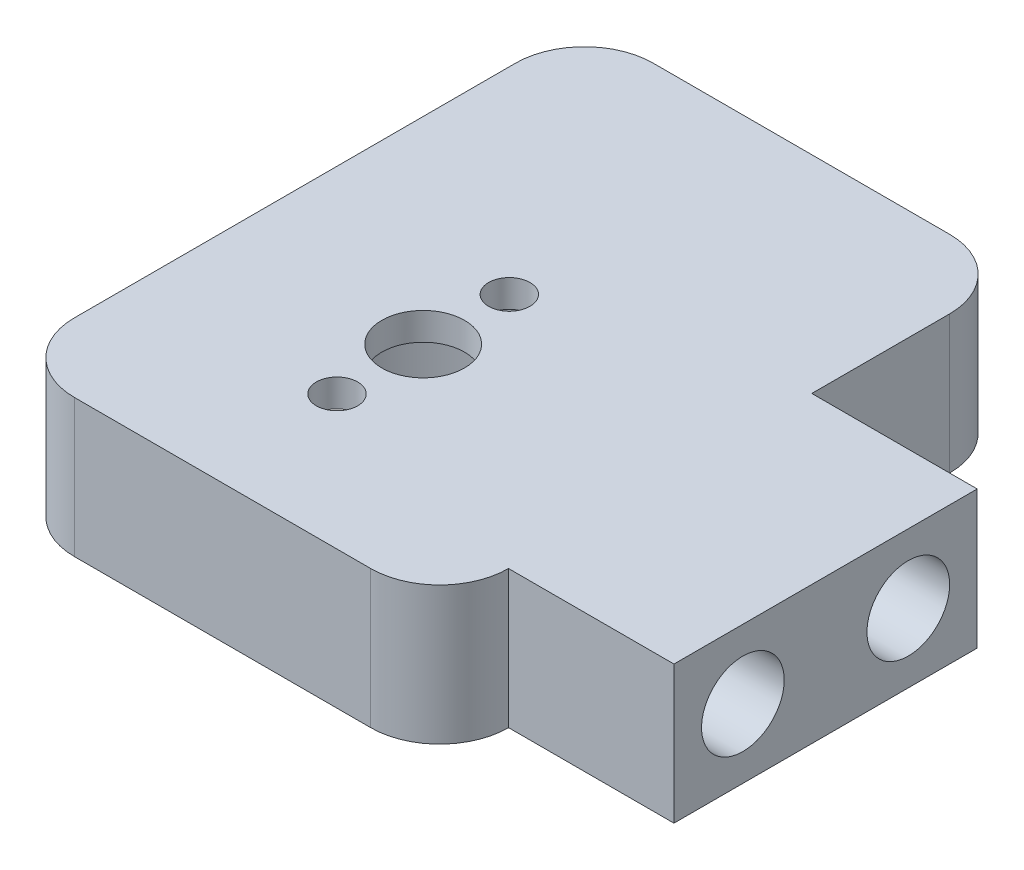
ISO-10303-21;
HEADER;
FILE_DESCRIPTION(('STEP AP214'),'2;1');
FILE_NAME('part.step','',(''),(''),'','','');
FILE_SCHEMA(('AUTOMOTIVE_DESIGN { 1 0 10303 214 1 1 1 1 }'));
ENDSEC;
DATA;
#1=APPLICATION_CONTEXT('core data for automotive mechanical design processes');
#2=APPLICATION_PROTOCOL_DEFINITION('international standard','automotive_design',2000,#1);
#3=PRODUCT_CONTEXT('',#1,'mechanical');
#4=PRODUCT('Part','Part','',(#3));
#5=PRODUCT_RELATED_PRODUCT_CATEGORY('part','',(#4));
#6=PRODUCT_DEFINITION_FORMATION('','',#4);
#7=PRODUCT_DEFINITION_CONTEXT('part definition',#1,'design');
#8=PRODUCT_DEFINITION('design','',#6,#7);
#9=PRODUCT_DEFINITION_SHAPE('','',#8);
#10=(LENGTH_UNIT() NAMED_UNIT(*) SI_UNIT(.MILLI.,.METRE.));
#11=(NAMED_UNIT(*) PLANE_ANGLE_UNIT() SI_UNIT($,.RADIAN.));
#12=(NAMED_UNIT(*) SI_UNIT($,.STERADIAN.) SOLID_ANGLE_UNIT());
#13=UNCERTAINTY_MEASURE_WITH_UNIT(LENGTH_MEASURE(1.E-05),#10,'distance_accuracy_value','');
#14=(GEOMETRIC_REPRESENTATION_CONTEXT(3) GLOBAL_UNCERTAINTY_ASSIGNED_CONTEXT((#13)) GLOBAL_UNIT_ASSIGNED_CONTEXT((#10,
#11,#12)) REPRESENTATION_CONTEXT('',''));
#15=CARTESIAN_POINT('',(0.,0.,0.));
#16=DIRECTION('',(0.,0.,1.));
#17=DIRECTION('',(1.,0.,0.));
#18=AXIS2_PLACEMENT_3D('',#15,#16,#17);
#19=CARTESIAN_POINT('',(0.,0.,0.));
#20=DIRECTION('',(0.,1.,0.));
#21=DIRECTION('',(0.,0.,1.));
#22=AXIS2_PLACEMENT_3D('',#19,#20,#21);
#23=PLANE('',#22);
#24=CARTESIAN_POINT('',(-11.6954640360802,0.,0.));
#25=DIRECTION('',(0.,-1.,0.));
#26=DIRECTION('',(0.,0.,-1.));
#27=AXIS2_PLACEMENT_3D('',#24,#25,#26);
#28=CIRCLE('',#27,11.);
#29=CARTESIAN_POINT('',(-11.6954640360802,0.,-11.));
#30=VERTEX_POINT('',#29);
#31=EDGE_CURVE('E225',#30,#30,#28,.T.);
#32=ORIENTED_EDGE('',*,*,#31,.F.);
#33=EDGE_LOOP('',(#32));
#34=FACE_BOUND('',#33,.T.);
#35=DIRECTION('',(0.,0.,1.));
#36=VECTOR('',#35,1.);
#37=CARTESIAN_POINT('',(0.500000000000008,0.,-24.));
#38=LINE('',#37,#36);
#39=CARTESIAN_POINT('',(0.500000000000008,0.,-26.));
#40=VERTEX_POINT('',#39);
#41=CARTESIAN_POINT('',(0.500000000000008,0.,-24.));
#42=VERTEX_POINT('',#41);
#43=EDGE_CURVE('E184',#40,#42,#38,.T.);
#44=ORIENTED_EDGE('',*,*,#43,.F.);
#45=CARTESIAN_POINT('',(0.500000000000008,0.,-21.));
#46=DIRECTION('',(0.,1.,0.));
#47=DIRECTION('',(0.,0.,1.));
#48=AXIS2_PLACEMENT_3D('',#45,#46,#47);
#49=CIRCLE('',#48,5.);
#50=CARTESIAN_POINT('',(5.50000000000001,0.,-21.));
#51=VERTEX_POINT('',#50);
#52=EDGE_CURVE('E326',#40,#51,#49,.F.);
#53=ORIENTED_EDGE('',*,*,#52,.T.);
#54=DIRECTION('',(0.,0.,-1.));
#55=VECTOR('',#54,1.);
#56=CARTESIAN_POINT('',(5.50000000000001,0.,-11.));
#57=LINE('',#56,#55);
#58=CARTESIAN_POINT('',(5.50000000000001,0.,-11.));
#59=VERTEX_POINT('',#58);
#60=EDGE_CURVE('E279',#59,#51,#57,.T.);
#61=ORIENTED_EDGE('',*,*,#60,.F.);
#62=DIRECTION('',(-1.,0.,0.));
#63=VECTOR('',#62,1.);
#64=CARTESIAN_POINT('',(5.50000000000001,0.,-11.));
#65=LINE('',#64,#63);
#66=CARTESIAN_POINT('',(17.5,0.,-11.));
#67=VERTEX_POINT('',#66);
#68=EDGE_CURVE('E276',#67,#59,#65,.T.);
#69=ORIENTED_EDGE('',*,*,#68,.F.);
#70=DIRECTION('',(0.,0.,-1.));
#71=VECTOR('',#70,1.);
#72=CARTESIAN_POINT('',(17.5,0.,-11.));
#73=LINE('',#72,#71);
#74=CARTESIAN_POINT('',(17.5,0.,11.));
#75=VERTEX_POINT('',#74);
#76=EDGE_CURVE('E233',#75,#67,#73,.T.);
#77=ORIENTED_EDGE('',*,*,#76,.F.);
#78=DIRECTION('',(1.,0.,0.));
#79=VECTOR('',#78,1.);
#80=CARTESIAN_POINT('',(5.50000000000001,0.,11.));
#81=LINE('',#80,#79);
#82=CARTESIAN_POINT('',(5.50000000000001,0.,11.));
#83=VERTEX_POINT('',#82);
#84=EDGE_CURVE('E250',#83,#75,#81,.T.);
#85=ORIENTED_EDGE('',*,*,#84,.F.);
#86=CARTESIAN_POINT('',(0.500000000000013,0.,11.));
#87=DIRECTION('',(0.,1.,0.));
#88=DIRECTION('',(0.,0.,1.));
#89=AXIS2_PLACEMENT_3D('',#86,#87,#88);
#90=CIRCLE('',#89,5.);
#91=CARTESIAN_POINT('',(0.500000000000014,0.,16.));
#92=VERTEX_POINT('',#91);
#93=EDGE_CURVE('E323',#83,#92,#90,.F.);
#94=ORIENTED_EDGE('',*,*,#93,.T.);
#95=DIRECTION('',(1.,0.,0.));
#96=VECTOR('',#95,1.);
#97=CARTESIAN_POINT('',(-26.,0.,16.));
#98=LINE('',#97,#96);
#99=CARTESIAN_POINT('',(-21.,0.,16.));
#100=VERTEX_POINT('',#99);
#101=EDGE_CURVE('E287',#100,#92,#98,.T.);
#102=ORIENTED_EDGE('',*,*,#101,.F.);
#103=CARTESIAN_POINT('',(-21.,0.,11.));
#104=DIRECTION('',(0.,1.,0.));
#105=DIRECTION('',(0.,0.,1.));
#106=AXIS2_PLACEMENT_3D('',#103,#104,#105);
#107=CIRCLE('',#106,5.);
#108=CARTESIAN_POINT('',(-26.,0.,11.));
#109=VERTEX_POINT('',#108);
#110=EDGE_CURVE('E320',#100,#109,#107,.F.);
#111=ORIENTED_EDGE('',*,*,#110,.T.);
#112=DIRECTION('',(0.,0.,1.));
#113=VECTOR('',#112,1.);
#114=CARTESIAN_POINT('',(-26.,0.,-26.));
#115=LINE('',#114,#113);
#116=CARTESIAN_POINT('',(-26.,0.,-21.));
#117=VERTEX_POINT('',#116);
#118=EDGE_CURVE('E283',#117,#109,#115,.T.);
#119=ORIENTED_EDGE('',*,*,#118,.F.);
#120=CARTESIAN_POINT('',(-21.,0.,-21.));
#121=DIRECTION('',(0.,1.,0.));
#122=DIRECTION('',(0.,0.,1.));
#123=AXIS2_PLACEMENT_3D('',#120,#121,#122);
#124=CIRCLE('',#123,5.);
#125=CARTESIAN_POINT('',(-21.,0.,-26.));
#126=VERTEX_POINT('',#125);
#127=EDGE_CURVE('E177',#117,#126,#124,.F.);
#128=ORIENTED_EDGE('',*,*,#127,.T.);
#129=DIRECTION('',(0.,0.,-1.));
#130=VECTOR('',#129,1.);
#131=CARTESIAN_POINT('',(-21.,0.,-26.));
#132=LINE('',#131,#130);
#133=CARTESIAN_POINT('',(-21.,0.,-24.));
#134=VERTEX_POINT('',#133);
#135=EDGE_CURVE('E160',#134,#126,#132,.T.);
#136=ORIENTED_EDGE('',*,*,#135,.F.);
#137=DIRECTION('',(-1.,0.,0.));
#138=VECTOR('',#137,1.);
#139=CARTESIAN_POINT('',(0.500000000000008,0.,-24.));
#140=LINE('',#139,#138);
#141=EDGE_CURVE('E174',#42,#134,#140,.T.);
#142=ORIENTED_EDGE('',*,*,#141,.F.);
#143=EDGE_LOOP('',(#44,#53,#61,#69,#77,#85,#94,#102,#111,#119,#128,#136,#142));
#144=FACE_BOUND('',#143,.T.);
#145=ADVANCED_FACE('F43',(#34,#144),#23,.F.);
#146=CARTESIAN_POINT('',(17.5,10.,-11.));
#147=DIRECTION('',(-1.,0.,0.));
#148=DIRECTION('',(0.,0.,1.));
#149=AXIS2_PLACEMENT_3D('',#146,#147,#148);
#150=PLANE('',#149);
#151=CARTESIAN_POINT('',(17.5,5.,6.));
#152=DIRECTION('',(1.,0.,0.));
#153=DIRECTION('',(0.,0.,-1.));
#154=AXIS2_PLACEMENT_3D('',#151,#152,#153);
#155=CIRCLE('',#154,3.);
#156=CARTESIAN_POINT('',(17.5,5.,3.));
#157=VERTEX_POINT('',#156);
#158=EDGE_CURVE('E234',#157,#157,#155,.T.);
#159=ORIENTED_EDGE('',*,*,#158,.F.);
#160=EDGE_LOOP('',(#159));
#161=FACE_BOUND('',#160,.T.);
#162=CARTESIAN_POINT('',(17.5,5.,-6.));
#163=DIRECTION('',(1.,0.,0.));
#164=DIRECTION('',(0.,0.,-1.));
#165=AXIS2_PLACEMENT_3D('',#162,#163,#164);
#166=CIRCLE('',#165,3.);
#167=CARTESIAN_POINT('',(17.5,5.,-9.));
#168=VERTEX_POINT('',#167);
#169=EDGE_CURVE('E224',#168,#168,#166,.T.);
#170=ORIENTED_EDGE('',*,*,#169,.F.);
#171=EDGE_LOOP('',(#170));
#172=FACE_BOUND('',#171,.T.);
#173=ORIENTED_EDGE('',*,*,#76,.T.);
#174=DIRECTION('',(0.,-1.,0.));
#175=VECTOR('',#174,1.);
#176=CARTESIAN_POINT('',(17.5,10.,-11.));
#177=LINE('',#176,#175);
#178=CARTESIAN_POINT('',(17.5,10.,-11.));
#179=VERTEX_POINT('',#178);
#180=EDGE_CURVE('E304',#179,#67,#177,.T.);
#181=ORIENTED_EDGE('',*,*,#180,.F.);
#182=DIRECTION('',(0.,0.,-1.));
#183=VECTOR('',#182,1.);
#184=CARTESIAN_POINT('',(17.5,10.,-11.));
#185=LINE('',#184,#183);
#186=CARTESIAN_POINT('',(17.5,10.,11.));
#187=VERTEX_POINT('',#186);
#188=EDGE_CURVE('E245',#187,#179,#185,.T.);
#189=ORIENTED_EDGE('',*,*,#188,.F.);
#190=DIRECTION('',(0.,-1.,0.));
#191=VECTOR('',#190,1.);
#192=CARTESIAN_POINT('',(17.5,10.,11.));
#193=LINE('',#192,#191);
#194=EDGE_CURVE('E272',#187,#75,#193,.T.);
#195=ORIENTED_EDGE('',*,*,#194,.T.);
#196=EDGE_LOOP('',(#173,#181,#189,#195));
#197=FACE_BOUND('',#196,.T.);
#198=ADVANCED_FACE('F432',(#161,#172,#197),#150,.F.);
#199=CARTESIAN_POINT('',(5.50000000000001,10.,-11.));
#200=DIRECTION('',(0.,0.,1.));
#201=DIRECTION('',(1.,0.,0.));
#202=AXIS2_PLACEMENT_3D('',#199,#200,#201);
#203=PLANE('',#202);
#204=ORIENTED_EDGE('',*,*,#68,.T.);
#205=DIRECTION('',(0.,-1.,0.));
#206=VECTOR('',#205,1.);
#207=CARTESIAN_POINT('',(5.50000000000001,10.,-11.));
#208=LINE('',#207,#206);
#209=CARTESIAN_POINT('',(5.50000000000001,10.,-11.));
#210=VERTEX_POINT('',#209);
#211=EDGE_CURVE('E300',#210,#59,#208,.T.);
#212=ORIENTED_EDGE('',*,*,#211,.F.);
#213=DIRECTION('',(-1.,0.,0.));
#214=VECTOR('',#213,1.);
#215=CARTESIAN_POINT('',(5.50000000000001,10.,-11.));
#216=LINE('',#215,#214);
#217=EDGE_CURVE('E249',#179,#210,#216,.T.);
#218=ORIENTED_EDGE('',*,*,#217,.F.);
#219=ORIENTED_EDGE('',*,*,#180,.T.);
#220=EDGE_LOOP('',(#204,#212,#218,#219));
#221=FACE_BOUND('',#220,.T.);
#222=ADVANCED_FACE('F434',(#221),#203,.F.);
#223=CARTESIAN_POINT('',(5.50000000000001,10.,-11.));
#224=DIRECTION('',(-1.,0.,0.));
#225=DIRECTION('',(0.,0.,1.));
#226=AXIS2_PLACEMENT_3D('',#223,#224,#225);
#227=PLANE('',#226);
#228=ORIENTED_EDGE('',*,*,#60,.T.);
#229=DIRECTION('',(0.,-1.,0.));
#230=VECTOR('',#229,1.);
#231=CARTESIAN_POINT('',(5.50000000000001,10.,-21.));
#232=LINE('',#231,#230);
#233=CARTESIAN_POINT('',(5.50000000000001,10.,-21.));
#234=VERTEX_POINT('',#233);
#235=EDGE_CURVE('E329',#51,#234,#232,.F.);
#236=ORIENTED_EDGE('',*,*,#235,.T.);
#237=DIRECTION('',(0.,0.,-1.));
#238=VECTOR('',#237,1.);
#239=CARTESIAN_POINT('',(5.50000000000001,10.,-11.));
#240=LINE('',#239,#238);
#241=EDGE_CURVE('E253',#210,#234,#240,.T.);
#242=ORIENTED_EDGE('',*,*,#241,.F.);
#243=ORIENTED_EDGE('',*,*,#211,.T.);
#244=EDGE_LOOP('',(#228,#236,#242,#243));
#245=FACE_BOUND('',#244,.T.);
#246=ADVANCED_FACE('F394',(#245),#227,.F.);
#247=CARTESIAN_POINT('',(5.50000000000001,10.,-26.));
#248=DIRECTION('',(0.,0.,1.));
#249=DIRECTION('',(1.,0.,0.));
#250=AXIS2_PLACEMENT_3D('',#247,#248,#249);
#251=PLANE('',#250);
#252=CARTESIAN_POINT('',(-16.,-5.,-26.));
#253=DIRECTION('',(0.,0.,1.));
#254=DIRECTION('',(1.,0.,0.));
#255=AXIS2_PLACEMENT_3D('',#252,#253,#254);
#256=CIRCLE('',#255,3.);
#257=CARTESIAN_POINT('',(-13.,-5.,-26.));
#258=VERTEX_POINT('',#257);
#259=EDGE_CURVE('E187',#258,#258,#256,.T.);
#260=ORIENTED_EDGE('',*,*,#259,.T.);
#261=EDGE_LOOP('',(#260));
#262=FACE_BOUND('',#261,.T.);
#263=CARTESIAN_POINT('',(-4.49999999999999,-5.,-26.));
#264=DIRECTION('',(0.,0.,1.));
#265=DIRECTION('',(1.,0.,0.));
#266=AXIS2_PLACEMENT_3D('',#263,#264,#265);
#267=CIRCLE('',#266,3.);
#268=CARTESIAN_POINT('',(-1.49999999999999,-5.,-26.));
#269=VERTEX_POINT('',#268);
#270=EDGE_CURVE('E468',#269,#269,#267,.T.);
#271=ORIENTED_EDGE('',*,*,#270,.T.);
#272=EDGE_LOOP('',(#271));
#273=FACE_BOUND('',#272,.T.);
#274=DIRECTION('',(0.,1.,0.));
#275=VECTOR('',#274,1.);
#276=CARTESIAN_POINT('',(0.500000000000008,-12.,-26.));
#277=LINE('',#276,#275);
#278=CARTESIAN_POINT('',(0.500000000000008,-7.,-26.));
#279=VERTEX_POINT('',#278);
#280=EDGE_CURVE('E191',#279,#40,#277,.T.);
#281=ORIENTED_EDGE('',*,*,#280,.F.);
#282=CARTESIAN_POINT('',(-4.49999999999999,-7.,-26.));
#283=DIRECTION('',(0.,0.,1.));
#284=DIRECTION('',(1.,0.,0.));
#285=AXIS2_PLACEMENT_3D('',#282,#283,#284);
#286=CIRCLE('',#285,5.);
#287=CARTESIAN_POINT('',(-4.49999999999999,-12.,-26.));
#288=VERTEX_POINT('',#287);
#289=EDGE_CURVE('E52',#279,#288,#286,.F.);
#290=ORIENTED_EDGE('',*,*,#289,.T.);
#291=DIRECTION('',(1.,0.,0.));
#292=VECTOR('',#291,1.);
#293=CARTESIAN_POINT('',(0.500000000000008,-12.,-26.));
#294=LINE('',#293,#292);
#295=CARTESIAN_POINT('',(-16.,-12.,-26.));
#296=VERTEX_POINT('',#295);
#297=EDGE_CURVE('E194',#296,#288,#294,.T.);
#298=ORIENTED_EDGE('',*,*,#297,.F.);
#299=CARTESIAN_POINT('',(-16.,-7.,-26.));
#300=DIRECTION('',(0.,0.,1.));
#301=DIRECTION('',(1.,0.,0.));
#302=AXIS2_PLACEMENT_3D('',#299,#300,#301);
#303=CIRCLE('',#302,5.);
#304=CARTESIAN_POINT('',(-21.,-7.,-26.));
#305=VERTEX_POINT('',#304);
#306=EDGE_CURVE('E59',#296,#305,#303,.F.);
#307=ORIENTED_EDGE('',*,*,#306,.T.);
#308=DIRECTION('',(0.,1.,0.));
#309=VECTOR('',#308,1.);
#310=CARTESIAN_POINT('',(-21.,-12.,-26.));
#311=LINE('',#310,#309);
#312=EDGE_CURVE('E168',#305,#126,#311,.T.);
#313=ORIENTED_EDGE('',*,*,#312,.T.);
#314=DIRECTION('',(0.,-1.,0.));
#315=VECTOR('',#314,1.);
#316=CARTESIAN_POINT('',(-21.,10.,-26.));
#317=LINE('',#316,#315);
#318=CARTESIAN_POINT('',(-21.,10.,-26.));
#319=VERTEX_POINT('',#318);
#320=EDGE_CURVE('E308',#126,#319,#317,.F.);
#321=ORIENTED_EDGE('',*,*,#320,.T.);
#322=DIRECTION('',(-1.,0.,0.));
#323=VECTOR('',#322,1.);
#324=CARTESIAN_POINT('',(5.50000000000001,10.,-26.));
#325=LINE('',#324,#323);
#326=CARTESIAN_POINT('',(0.500000000000007,10.,-26.));
#327=VERTEX_POINT('',#326);
#328=EDGE_CURVE('E257',#327,#319,#325,.T.);
#329=ORIENTED_EDGE('',*,*,#328,.F.);
#330=DIRECTION('',(0.,-1.,0.));
#331=VECTOR('',#330,1.);
#332=CARTESIAN_POINT('',(0.500000000000007,10.,-26.));
#333=LINE('',#332,#331);
#334=EDGE_CURVE('E314',#327,#40,#333,.T.);
#335=ORIENTED_EDGE('',*,*,#334,.T.);
#336=EDGE_LOOP('',(#281,#290,#298,#307,#313,#321,#329,#335));
#337=FACE_BOUND('',#336,.T.);
#338=ADVANCED_FACE('F378',(#262,#273,#337),#251,.F.);
#339=CARTESIAN_POINT('',(-26.,10.,-26.));
#340=DIRECTION('',(1.,0.,0.));
#341=DIRECTION('',(0.,0.,-1.));
#342=AXIS2_PLACEMENT_3D('',#339,#340,#341);
#343=PLANE('',#342);
#344=ORIENTED_EDGE('',*,*,#118,.T.);
#345=DIRECTION('',(0.,-1.,0.));
#346=VECTOR('',#345,1.);
#347=CARTESIAN_POINT('',(-26.,10.,11.));
#348=LINE('',#347,#346);
#349=CARTESIAN_POINT('',(-26.,10.,11.));
#350=VERTEX_POINT('',#349);
#351=EDGE_CURVE('E355',#109,#350,#348,.F.);
#352=ORIENTED_EDGE('',*,*,#351,.T.);
#353=DIRECTION('',(0.,0.,1.));
#354=VECTOR('',#353,1.);
#355=CARTESIAN_POINT('',(-26.,10.,-26.));
#356=LINE('',#355,#354);
#357=CARTESIAN_POINT('',(-26.,10.,-21.));
#358=VERTEX_POINT('',#357);
#359=EDGE_CURVE('E261',#358,#350,#356,.T.);
#360=ORIENTED_EDGE('',*,*,#359,.F.);
#361=DIRECTION('',(0.,-1.,0.));
#362=VECTOR('',#361,1.);
#363=CARTESIAN_POINT('',(-26.,10.,-21.));
#364=LINE('',#363,#362);
#365=EDGE_CURVE('E351',#358,#117,#364,.T.);
#366=ORIENTED_EDGE('',*,*,#365,.T.);
#367=EDGE_LOOP('',(#344,#352,#360,#366));
#368=FACE_BOUND('',#367,.T.);
#369=ADVANCED_FACE('F409',(#368),#343,.F.);
#370=CARTESIAN_POINT('',(-26.,10.,16.));
#371=DIRECTION('',(0.,0.,-1.));
#372=DIRECTION('',(-1.,0.,0.));
#373=AXIS2_PLACEMENT_3D('',#370,#371,#372);
#374=PLANE('',#373);
#375=ORIENTED_EDGE('',*,*,#101,.T.);
#376=DIRECTION('',(0.,-1.,0.));
#377=VECTOR('',#376,1.);
#378=CARTESIAN_POINT('',(0.500000000000014,10.,16.));
#379=LINE('',#378,#377);
#380=CARTESIAN_POINT('',(0.500000000000014,10.,16.));
#381=VERTEX_POINT('',#380);
#382=EDGE_CURVE('E348',#92,#381,#379,.F.);
#383=ORIENTED_EDGE('',*,*,#382,.T.);
#384=DIRECTION('',(1.,0.,0.));
#385=VECTOR('',#384,1.);
#386=CARTESIAN_POINT('',(-26.,10.,16.));
#387=LINE('',#386,#385);
#388=CARTESIAN_POINT('',(-21.,10.,16.));
#389=VERTEX_POINT('',#388);
#390=EDGE_CURVE('E265',#389,#381,#387,.T.);
#391=ORIENTED_EDGE('',*,*,#390,.F.);
#392=DIRECTION('',(0.,-1.,0.));
#393=VECTOR('',#392,1.);
#394=CARTESIAN_POINT('',(-21.,10.,16.));
#395=LINE('',#394,#393);
#396=EDGE_CURVE('E344',#389,#100,#395,.T.);
#397=ORIENTED_EDGE('',*,*,#396,.T.);
#398=EDGE_LOOP('',(#375,#383,#391,#397));
#399=FACE_BOUND('',#398,.T.);
#400=ADVANCED_FACE('F417',(#399),#374,.F.);
#401=CARTESIAN_POINT('',(5.50000000000001,10.,11.));
#402=DIRECTION('',(0.,0.,-1.));
#403=DIRECTION('',(-1.,0.,0.));
#404=AXIS2_PLACEMENT_3D('',#401,#402,#403);
#405=PLANE('',#404);
#406=ORIENTED_EDGE('',*,*,#84,.T.);
#407=ORIENTED_EDGE('',*,*,#194,.F.);
#408=DIRECTION('',(1.,0.,0.));
#409=VECTOR('',#408,1.);
#410=CARTESIAN_POINT('',(5.50000000000001,10.,11.));
#411=LINE('',#410,#409);
#412=CARTESIAN_POINT('',(5.50000000000001,10.,11.));
#413=VERTEX_POINT('',#412);
#414=EDGE_CURVE('E269',#413,#187,#411,.T.);
#415=ORIENTED_EDGE('',*,*,#414,.F.);
#416=DIRECTION('',(0.,-1.,0.));
#417=VECTOR('',#416,1.);
#418=CARTESIAN_POINT('',(5.50000000000001,10.,11.));
#419=LINE('',#418,#417);
#420=EDGE_CURVE('E296',#413,#83,#419,.T.);
#421=ORIENTED_EDGE('',*,*,#420,.T.);
#422=EDGE_LOOP('',(#406,#407,#415,#421));
#423=FACE_BOUND('',#422,.T.);
#424=ADVANCED_FACE('F426',(#423),#405,.F.);
#425=CARTESIAN_POINT('',(0.,10.,0.));
#426=DIRECTION('',(0.,1.,0.));
#427=DIRECTION('',(0.,0.,1.));
#428=AXIS2_PLACEMENT_3D('',#425,#426,#427);
#429=PLANE('',#428);
#430=CARTESIAN_POINT('',(-11.6954640360802,10.,-6.25));
#431=DIRECTION('',(0.,1.,0.));
#432=DIRECTION('',(0.,0.,1.));
#433=AXIS2_PLACEMENT_3D('',#430,#431,#432);
#434=CIRCLE('',#433,1.5);
#435=CARTESIAN_POINT('',(-11.6954640360802,10.,-4.75));
#436=VERTEX_POINT('',#435);
#437=EDGE_CURVE('E215',#436,#436,#434,.T.);
#438=ORIENTED_EDGE('',*,*,#437,.F.);
#439=EDGE_LOOP('',(#438));
#440=FACE_BOUND('',#439,.T.);
#441=CARTESIAN_POINT('',(-11.6954640360802,10.,6.25));
#442=DIRECTION('',(0.,1.,0.));
#443=DIRECTION('',(0.,0.,1.));
#444=AXIS2_PLACEMENT_3D('',#441,#442,#443);
#445=CIRCLE('',#444,1.5);
#446=CARTESIAN_POINT('',(-11.6954640360802,10.,7.75));
#447=VERTEX_POINT('',#446);
#448=EDGE_CURVE('E211',#447,#447,#445,.T.);
#449=ORIENTED_EDGE('',*,*,#448,.F.);
#450=EDGE_LOOP('',(#449));
#451=FACE_BOUND('',#450,.T.);
#452=CARTESIAN_POINT('',(-11.6954640360802,10.,0.));
#453=DIRECTION('',(0.,1.,0.));
#454=DIRECTION('',(0.,0.,1.));
#455=AXIS2_PLACEMENT_3D('',#452,#453,#454);
#456=CIRCLE('',#455,3.);
#457=CARTESIAN_POINT('',(-11.6954640360802,10.,3.));
#458=VERTEX_POINT('',#457);
#459=EDGE_CURVE('E219',#458,#458,#456,.T.);
#460=ORIENTED_EDGE('',*,*,#459,.F.);
#461=EDGE_LOOP('',(#460));
#462=FACE_BOUND('',#461,.T.);
#463=ORIENTED_EDGE('',*,*,#241,.T.);
#464=CARTESIAN_POINT('',(0.500000000000008,10.,-21.));
#465=DIRECTION('',(0.,1.,0.));
#466=DIRECTION('',(0.,0.,1.));
#467=AXIS2_PLACEMENT_3D('',#464,#465,#466);
#468=CIRCLE('',#467,5.);
#469=EDGE_CURVE('E341',#234,#327,#468,.T.);
#470=ORIENTED_EDGE('',*,*,#469,.T.);
#471=ORIENTED_EDGE('',*,*,#328,.T.);
#472=CARTESIAN_POINT('',(-21.,10.,-21.));
#473=DIRECTION('',(0.,1.,0.));
#474=DIRECTION('',(0.,0.,1.));
#475=AXIS2_PLACEMENT_3D('',#472,#473,#474);
#476=CIRCLE('',#475,5.);
#477=EDGE_CURVE('E332',#319,#358,#476,.T.);
#478=ORIENTED_EDGE('',*,*,#477,.T.);
#479=ORIENTED_EDGE('',*,*,#359,.T.);
#480=CARTESIAN_POINT('',(-21.,10.,11.));
#481=DIRECTION('',(0.,1.,0.));
#482=DIRECTION('',(0.,0.,1.));
#483=AXIS2_PLACEMENT_3D('',#480,#481,#482);
#484=CIRCLE('',#483,5.);
#485=EDGE_CURVE('E335',#350,#389,#484,.T.);
#486=ORIENTED_EDGE('',*,*,#485,.T.);
#487=ORIENTED_EDGE('',*,*,#390,.T.);
#488=CARTESIAN_POINT('',(0.500000000000013,10.,11.));
#489=DIRECTION('',(0.,1.,0.));
#490=DIRECTION('',(0.,0.,1.));
#491=AXIS2_PLACEMENT_3D('',#488,#489,#490);
#492=CIRCLE('',#491,5.);
#493=EDGE_CURVE('E338',#381,#413,#492,.T.);
#494=ORIENTED_EDGE('',*,*,#493,.T.);
#495=ORIENTED_EDGE('',*,*,#414,.T.);
#496=ORIENTED_EDGE('',*,*,#188,.T.);
#497=ORIENTED_EDGE('',*,*,#217,.T.);
#498=EDGE_LOOP('',(#463,#470,#471,#478,#479,#486,#487,#494,#495,#496,#497));
#499=FACE_BOUND('',#498,.T.);
#500=ADVANCED_FACE('F401',(#440,#451,#462,#499),#429,.T.);
#501=CARTESIAN_POINT('',(7.50000000000001,5.,-6.));
#502=DIRECTION('',(1.,0.,0.));
#503=DIRECTION('',(0.,0.,-1.));
#504=AXIS2_PLACEMENT_3D('',#501,#502,#503);
#505=CYLINDRICAL_SURFACE('',#504,3.);
#506=CARTESIAN_POINT('',(7.50000000000001,5.,-6.));
#507=DIRECTION('',(1.,0.,0.));
#508=DIRECTION('',(0.,0.,-1.));
#509=AXIS2_PLACEMENT_3D('',#506,#507,#508);
#510=CIRCLE('',#509,3.);
#511=CARTESIAN_POINT('',(7.50000000000001,5.,-9.));
#512=VERTEX_POINT('',#511);
#513=EDGE_CURVE('E238',#512,#512,#510,.T.);
#514=ORIENTED_EDGE('',*,*,#513,.F.);
#515=EDGE_LOOP('',(#514));
#516=FACE_BOUND('',#515,.T.);
#517=ORIENTED_EDGE('',*,*,#169,.T.);
#518=EDGE_LOOP('',(#517));
#519=FACE_BOUND('',#518,.T.);
#520=ADVANCED_FACE('F547',(#516,#519),#505,.F.);
#521=CARTESIAN_POINT('',(7.50000000000001,5.,-6.));
#522=DIRECTION('',(1.,0.,0.));
#523=DIRECTION('',(0.,0.,-1.));
#524=AXIS2_PLACEMENT_3D('',#521,#522,#523);
#525=PLANE('',#524);
#526=ORIENTED_EDGE('',*,*,#513,.T.);
#527=EDGE_LOOP('',(#526));
#528=FACE_BOUND('',#527,.T.);
#529=ADVANCED_FACE('F544',(#528),#525,.T.);
#530=CARTESIAN_POINT('',(7.50000000000001,5.,6.));
#531=DIRECTION('',(1.,0.,0.));
#532=DIRECTION('',(0.,0.,-1.));
#533=AXIS2_PLACEMENT_3D('',#530,#531,#532);
#534=CYLINDRICAL_SURFACE('',#533,3.);
#535=CARTESIAN_POINT('',(7.50000000000001,5.,6.));
#536=DIRECTION('',(1.,0.,0.));
#537=DIRECTION('',(0.,0.,-1.));
#538=AXIS2_PLACEMENT_3D('',#535,#536,#537);
#539=CIRCLE('',#538,3.);
#540=CARTESIAN_POINT('',(7.50000000000001,5.,3.));
#541=VERTEX_POINT('',#540);
#542=EDGE_CURVE('E229',#541,#541,#539,.T.);
#543=ORIENTED_EDGE('',*,*,#542,.F.);
#544=EDGE_LOOP('',(#543));
#545=FACE_BOUND('',#544,.T.);
#546=ORIENTED_EDGE('',*,*,#158,.T.);
#547=EDGE_LOOP('',(#546));
#548=FACE_BOUND('',#547,.T.);
#549=ADVANCED_FACE('F540',(#545,#548),#534,.F.);
#550=CARTESIAN_POINT('',(7.50000000000001,5.,6.));
#551=DIRECTION('',(1.,0.,0.));
#552=DIRECTION('',(0.,0.,-1.));
#553=AXIS2_PLACEMENT_3D('',#550,#551,#552);
#554=PLANE('',#553);
#555=ORIENTED_EDGE('',*,*,#542,.T.);
#556=EDGE_LOOP('',(#555));
#557=FACE_BOUND('',#556,.T.);
#558=ADVANCED_FACE('F536',(#557),#554,.T.);
#559=CARTESIAN_POINT('',(-11.6954640360802,8.,0.));
#560=DIRECTION('',(0.,-1.,0.));
#561=DIRECTION('',(0.,0.,-1.));
#562=AXIS2_PLACEMENT_3D('',#559,#560,#561);
#563=CYLINDRICAL_SURFACE('',#562,11.);
#564=CARTESIAN_POINT('',(-11.6954640360802,8.,0.));
#565=DIRECTION('',(0.,-1.,0.));
#566=DIRECTION('',(0.,0.,-1.));
#567=AXIS2_PLACEMENT_3D('',#564,#565,#566);
#568=CIRCLE('',#567,11.);
#569=CARTESIAN_POINT('',(-11.6954640360802,8.,-11.));
#570=VERTEX_POINT('',#569);
#571=EDGE_CURVE('E220',#570,#570,#568,.T.);
#572=ORIENTED_EDGE('',*,*,#571,.F.);
#573=EDGE_LOOP('',(#572));
#574=FACE_BOUND('',#573,.T.);
#575=ORIENTED_EDGE('',*,*,#31,.T.);
#576=EDGE_LOOP('',(#575));
#577=FACE_BOUND('',#576,.T.);
#578=ADVANCED_FACE('F532',(#574,#577),#563,.F.);
#579=CARTESIAN_POINT('',(-11.6954640360802,8.,0.));
#580=DIRECTION('',(0.,-1.,0.));
#581=DIRECTION('',(0.,0.,-1.));
#582=AXIS2_PLACEMENT_3D('',#579,#580,#581);
#583=PLANE('',#582);
#584=CARTESIAN_POINT('',(-11.6954640360802,8.,0.));
#585=DIRECTION('',(0.,-1.,0.));
#586=DIRECTION('',(0.,0.,-1.));
#587=AXIS2_PLACEMENT_3D('',#584,#585,#586);
#588=CIRCLE('',#587,3.);
#589=CARTESIAN_POINT('',(-11.6954640360802,8.,-3.));
#590=VERTEX_POINT('',#589);
#591=EDGE_CURVE('E204',#590,#590,#588,.T.);
#592=ORIENTED_EDGE('',*,*,#591,.F.);
#593=EDGE_LOOP('',(#592));
#594=FACE_BOUND('',#593,.T.);
#595=CARTESIAN_POINT('',(-11.6954640360802,8.,-6.25));
#596=DIRECTION('',(0.,-1.,0.));
#597=DIRECTION('',(0.,0.,-1.));
#598=AXIS2_PLACEMENT_3D('',#595,#596,#597);
#599=CIRCLE('',#598,1.5);
#600=CARTESIAN_POINT('',(-11.6954640360802,8.,-7.75));
#601=VERTEX_POINT('',#600);
#602=EDGE_CURVE('E199',#601,#601,#599,.T.);
#603=ORIENTED_EDGE('',*,*,#602,.F.);
#604=EDGE_LOOP('',(#603));
#605=FACE_BOUND('',#604,.T.);
#606=CARTESIAN_POINT('',(-11.6954640360802,8.,6.25));
#607=DIRECTION('',(0.,-1.,0.));
#608=DIRECTION('',(0.,0.,-1.));
#609=AXIS2_PLACEMENT_3D('',#606,#607,#608);
#610=CIRCLE('',#609,1.5);
#611=CARTESIAN_POINT('',(-11.6954640360802,8.,4.75));
#612=VERTEX_POINT('',#611);
#613=EDGE_CURVE('E200',#612,#612,#610,.T.);
#614=ORIENTED_EDGE('',*,*,#613,.F.);
#615=EDGE_LOOP('',(#614));
#616=FACE_BOUND('',#615,.T.);
#617=ORIENTED_EDGE('',*,*,#571,.T.);
#618=EDGE_LOOP('',(#617));
#619=FACE_BOUND('',#618,.T.);
#620=ADVANCED_FACE('F522',(#594,#605,#616,#619),#583,.T.);
#621=CARTESIAN_POINT('',(-11.6954640360802,16.,6.25));
#622=DIRECTION('',(0.,-1.,0.));
#623=DIRECTION('',(0.,0.,-1.));
#624=AXIS2_PLACEMENT_3D('',#621,#622,#623);
#625=CYLINDRICAL_SURFACE('',#624,1.5);
#626=ORIENTED_EDGE('',*,*,#448,.T.);
#627=EDGE_LOOP('',(#626));
#628=FACE_BOUND('',#627,.T.);
#629=ORIENTED_EDGE('',*,*,#613,.T.);
#630=EDGE_LOOP('',(#629));
#631=FACE_BOUND('',#630,.T.);
#632=ADVANCED_FACE('F518',(#628,#631),#625,.F.);
#633=CARTESIAN_POINT('',(-11.6954640360802,16.,-6.25));
#634=DIRECTION('',(0.,-1.,0.));
#635=DIRECTION('',(0.,0.,-1.));
#636=AXIS2_PLACEMENT_3D('',#633,#634,#635);
#637=CYLINDRICAL_SURFACE('',#636,1.5);
#638=ORIENTED_EDGE('',*,*,#437,.T.);
#639=EDGE_LOOP('',(#638));
#640=FACE_BOUND('',#639,.T.);
#641=ORIENTED_EDGE('',*,*,#602,.T.);
#642=EDGE_LOOP('',(#641));
#643=FACE_BOUND('',#642,.T.);
#644=ADVANCED_FACE('F521',(#640,#643),#637,.F.);
#645=CARTESIAN_POINT('',(-11.6954640360802,16.,0.));
#646=DIRECTION('',(0.,-1.,0.));
#647=DIRECTION('',(0.,0.,-1.));
#648=AXIS2_PLACEMENT_3D('',#645,#646,#647);
#649=CYLINDRICAL_SURFACE('',#648,3.);
#650=ORIENTED_EDGE('',*,*,#459,.T.);
#651=EDGE_LOOP('',(#650));
#652=FACE_BOUND('',#651,.T.);
#653=ORIENTED_EDGE('',*,*,#591,.T.);
#654=EDGE_LOOP('',(#653));
#655=FACE_BOUND('',#654,.T.);
#656=ADVANCED_FACE('F517',(#652,#655),#649,.F.);
#657=CARTESIAN_POINT('',(0.500000000000008,-12.,-24.));
#658=DIRECTION('',(-1.,0.,0.));
#659=DIRECTION('',(0.,0.,1.));
#660=AXIS2_PLACEMENT_3D('',#657,#658,#659);
#661=PLANE('',#660);
#662=DIRECTION('',(0.,1.,0.));
#663=VECTOR('',#662,1.);
#664=CARTESIAN_POINT('',(0.500000000000008,-12.,-24.));
#665=LINE('',#664,#663);
#666=CARTESIAN_POINT('',(0.500000000000008,-7.,-24.));
#667=VERTEX_POINT('',#666);
#668=EDGE_CURVE('E167',#667,#42,#665,.T.);
#669=ORIENTED_EDGE('',*,*,#668,.F.);
#670=DIRECTION('',(0.,0.,1.));
#671=VECTOR('',#670,1.);
#672=CARTESIAN_POINT('',(0.500000000000008,-7.,-24.));
#673=LINE('',#672,#671);
#674=EDGE_CURVE('E67',#667,#279,#673,.F.);
#675=ORIENTED_EDGE('',*,*,#674,.T.);
#676=ORIENTED_EDGE('',*,*,#280,.T.);
#677=ORIENTED_EDGE('',*,*,#43,.T.);
#678=EDGE_LOOP('',(#669,#675,#676,#677));
#679=FACE_BOUND('',#678,.T.);
#680=ADVANCED_FACE('F387',(#679),#661,.F.);
#681=CARTESIAN_POINT('',(0.500000000000008,-12.,-24.));
#682=DIRECTION('',(0.,0.,-1.));
#683=DIRECTION('',(-1.,0.,0.));
#684=AXIS2_PLACEMENT_3D('',#681,#682,#683);
#685=PLANE('',#684);
#686=CARTESIAN_POINT('',(-16.,-5.,-24.));
#687=DIRECTION('',(0.,0.,1.));
#688=DIRECTION('',(1.,0.,0.));
#689=AXIS2_PLACEMENT_3D('',#686,#687,#688);
#690=CIRCLE('',#689,3.);
#691=CARTESIAN_POINT('',(-13.,-5.,-24.));
#692=VERTEX_POINT('',#691);
#693=EDGE_CURVE('E471',#692,#692,#690,.T.);
#694=ORIENTED_EDGE('',*,*,#693,.F.);
#695=EDGE_LOOP('',(#694));
#696=FACE_BOUND('',#695,.T.);
#697=CARTESIAN_POINT('',(-4.49999999999999,-5.,-24.));
#698=DIRECTION('',(0.,0.,1.));
#699=DIRECTION('',(1.,0.,0.));
#700=AXIS2_PLACEMENT_3D('',#697,#698,#699);
#701=CIRCLE('',#700,3.);
#702=CARTESIAN_POINT('',(-1.49999999999999,-5.,-24.));
#703=VERTEX_POINT('',#702);
#704=EDGE_CURVE('E477',#703,#703,#701,.T.);
#705=ORIENTED_EDGE('',*,*,#704,.F.);
#706=EDGE_LOOP('',(#705));
#707=FACE_BOUND('',#706,.T.);
#708=DIRECTION('',(-1.,0.,0.));
#709=VECTOR('',#708,1.);
#710=CARTESIAN_POINT('',(0.500000000000008,-12.,-24.));
#711=LINE('',#710,#709);
#712=CARTESIAN_POINT('',(-4.49999999999999,-12.,-24.));
#713=VERTEX_POINT('',#712);
#714=CARTESIAN_POINT('',(-16.,-12.,-24.));
#715=VERTEX_POINT('',#714);
#716=EDGE_CURVE('E179',#713,#715,#711,.T.);
#717=ORIENTED_EDGE('',*,*,#716,.F.);
#718=CARTESIAN_POINT('',(-4.49999999999999,-7.,-24.));
#719=DIRECTION('',(0.,0.,-1.));
#720=DIRECTION('',(-1.,0.,0.));
#721=AXIS2_PLACEMENT_3D('',#718,#719,#720);
#722=CIRCLE('',#721,5.);
#723=EDGE_CURVE('E369',#713,#667,#722,.F.);
#724=ORIENTED_EDGE('',*,*,#723,.T.);
#725=ORIENTED_EDGE('',*,*,#668,.T.);
#726=ORIENTED_EDGE('',*,*,#141,.T.);
#727=DIRECTION('',(0.,1.,0.));
#728=VECTOR('',#727,1.);
#729=CARTESIAN_POINT('',(-21.,-12.,-24.));
#730=LINE('',#729,#728);
#731=CARTESIAN_POINT('',(-21.,-7.,-24.));
#732=VERTEX_POINT('',#731);
#733=EDGE_CURVE('E157',#732,#134,#730,.T.);
#734=ORIENTED_EDGE('',*,*,#733,.F.);
#735=CARTESIAN_POINT('',(-16.,-7.,-24.));
#736=DIRECTION('',(0.,0.,-1.));
#737=DIRECTION('',(-1.,0.,0.));
#738=AXIS2_PLACEMENT_3D('',#735,#736,#737);
#739=CIRCLE('',#738,5.);
#740=EDGE_CURVE('E366',#732,#715,#739,.F.);
#741=ORIENTED_EDGE('',*,*,#740,.T.);
#742=EDGE_LOOP('',(#717,#724,#725,#726,#734,#741));
#743=FACE_BOUND('',#742,.T.);
#744=ADVANCED_FACE('F182',(#696,#707,#743),#685,.F.);
#745=CARTESIAN_POINT('',(-21.,-12.,-26.));
#746=DIRECTION('',(1.,0.,0.));
#747=DIRECTION('',(0.,0.,-1.));
#748=AXIS2_PLACEMENT_3D('',#745,#746,#747);
#749=PLANE('',#748);
#750=ORIENTED_EDGE('',*,*,#312,.F.);
#751=DIRECTION('',(0.,0.,-1.));
#752=VECTOR('',#751,1.);
#753=CARTESIAN_POINT('',(-21.,-7.,-26.));
#754=LINE('',#753,#752);
#755=EDGE_CURVE('E11',#305,#732,#754,.F.);
#756=ORIENTED_EDGE('',*,*,#755,.T.);
#757=ORIENTED_EDGE('',*,*,#733,.T.);
#758=ORIENTED_EDGE('',*,*,#135,.T.);
#759=EDGE_LOOP('',(#750,#756,#757,#758));
#760=FACE_BOUND('',#759,.T.);
#761=ADVANCED_FACE('F159',(#760),#749,.F.);
#762=CARTESIAN_POINT('',(0.,-12.,0.));
#763=DIRECTION('',(0.,1.,0.));
#764=DIRECTION('',(0.,0.,1.));
#765=AXIS2_PLACEMENT_3D('',#762,#763,#764);
#766=PLANE('',#765);
#767=ORIENTED_EDGE('',*,*,#297,.T.);
#768=DIRECTION('',(0.,0.,1.));
#769=VECTOR('',#768,1.);
#770=CARTESIAN_POINT('',(-4.49999999999999,-12.,0.));
#771=LINE('',#770,#769);
#772=EDGE_CURVE('E362',#288,#713,#771,.T.);
#773=ORIENTED_EDGE('',*,*,#772,.T.);
#774=ORIENTED_EDGE('',*,*,#716,.T.);
#775=DIRECTION('',(0.,0.,-1.));
#776=VECTOR('',#775,1.);
#777=CARTESIAN_POINT('',(-16.,-12.,0.));
#778=LINE('',#777,#776);
#779=EDGE_CURVE('E358',#715,#296,#778,.T.);
#780=ORIENTED_EDGE('',*,*,#779,.T.);
#781=EDGE_LOOP('',(#767,#773,#774,#780));
#782=FACE_BOUND('',#781,.T.);
#783=ADVANCED_FACE('F382',(#782),#766,.F.);
#784=CARTESIAN_POINT('',(0.500000000000008,10.,-21.));
#785=DIRECTION('',(0.,-1.,0.));
#786=DIRECTION('',(0.,0.,-1.));
#787=AXIS2_PLACEMENT_3D('',#784,#785,#786);
#788=CYLINDRICAL_SURFACE('',#787,5.);
#789=ORIENTED_EDGE('',*,*,#469,.F.);
#790=ORIENTED_EDGE('',*,*,#235,.F.);
#791=ORIENTED_EDGE('',*,*,#52,.F.);
#792=ORIENTED_EDGE('',*,*,#334,.F.);
#793=EDGE_LOOP('',(#789,#790,#791,#792));
#794=FACE_BOUND('',#793,.T.);
#795=ADVANCED_FACE('F398',(#794),#788,.T.);
#796=CARTESIAN_POINT('',(0.500000000000013,10.,11.));
#797=DIRECTION('',(0.,-1.,0.));
#798=DIRECTION('',(0.,0.,-1.));
#799=AXIS2_PLACEMENT_3D('',#796,#797,#798);
#800=CYLINDRICAL_SURFACE('',#799,5.);
#801=ORIENTED_EDGE('',*,*,#493,.F.);
#802=ORIENTED_EDGE('',*,*,#382,.F.);
#803=ORIENTED_EDGE('',*,*,#93,.F.);
#804=ORIENTED_EDGE('',*,*,#420,.F.);
#805=EDGE_LOOP('',(#801,#802,#803,#804));
#806=FACE_BOUND('',#805,.T.);
#807=ADVANCED_FACE('F421',(#806),#800,.T.);
#808=CARTESIAN_POINT('',(-21.,10.,11.));
#809=DIRECTION('',(0.,-1.,0.));
#810=DIRECTION('',(0.,0.,-1.));
#811=AXIS2_PLACEMENT_3D('',#808,#809,#810);
#812=CYLINDRICAL_SURFACE('',#811,5.);
#813=ORIENTED_EDGE('',*,*,#485,.F.);
#814=ORIENTED_EDGE('',*,*,#351,.F.);
#815=ORIENTED_EDGE('',*,*,#110,.F.);
#816=ORIENTED_EDGE('',*,*,#396,.F.);
#817=EDGE_LOOP('',(#813,#814,#815,#816));
#818=FACE_BOUND('',#817,.T.);
#819=ADVANCED_FACE('F412',(#818),#812,.T.);
#820=CARTESIAN_POINT('',(-21.,10.,-21.));
#821=DIRECTION('',(0.,-1.,0.));
#822=DIRECTION('',(0.,0.,-1.));
#823=AXIS2_PLACEMENT_3D('',#820,#821,#822);
#824=CYLINDRICAL_SURFACE('',#823,5.);
#825=ORIENTED_EDGE('',*,*,#477,.F.);
#826=ORIENTED_EDGE('',*,*,#320,.F.);
#827=ORIENTED_EDGE('',*,*,#127,.F.);
#828=ORIENTED_EDGE('',*,*,#365,.F.);
#829=EDGE_LOOP('',(#825,#826,#827,#828));
#830=FACE_BOUND('',#829,.T.);
#831=ADVANCED_FACE('F404',(#830),#824,.T.);
#832=CARTESIAN_POINT('',(-4.49999999999999,-5.,-44.));
#833=DIRECTION('',(0.,0.,1.));
#834=DIRECTION('',(1.,0.,0.));
#835=AXIS2_PLACEMENT_3D('',#832,#833,#834);
#836=CYLINDRICAL_SURFACE('',#835,3.);
#837=ORIENTED_EDGE('',*,*,#704,.T.);
#838=EDGE_LOOP('',(#837));
#839=FACE_BOUND('',#838,.T.);
#840=ORIENTED_EDGE('',*,*,#270,.F.);
#841=EDGE_LOOP('',(#840));
#842=FACE_BOUND('',#841,.T.);
#843=ADVANCED_FACE('F491',(#839,#842),#836,.F.);
#844=CARTESIAN_POINT('',(-16.,-5.,-44.));
#845=DIRECTION('',(0.,0.,1.));
#846=DIRECTION('',(1.,0.,0.));
#847=AXIS2_PLACEMENT_3D('',#844,#845,#846);
#848=CYLINDRICAL_SURFACE('',#847,3.);
#849=ORIENTED_EDGE('',*,*,#693,.T.);
#850=EDGE_LOOP('',(#849));
#851=FACE_BOUND('',#850,.T.);
#852=ORIENTED_EDGE('',*,*,#259,.F.);
#853=EDGE_LOOP('',(#852));
#854=FACE_BOUND('',#853,.T.);
#855=ADVANCED_FACE('F487',(#851,#854),#848,.F.);
#856=CARTESIAN_POINT('',(-4.49999999999999,-7.,0.));
#857=DIRECTION('',(0.,0.,1.));
#858=DIRECTION('',(1.,0.,0.));
#859=AXIS2_PLACEMENT_3D('',#856,#857,#858);
#860=CYLINDRICAL_SURFACE('',#859,5.);
#861=ORIENTED_EDGE('',*,*,#289,.F.);
#862=ORIENTED_EDGE('',*,*,#674,.F.);
#863=ORIENTED_EDGE('',*,*,#723,.F.);
#864=ORIENTED_EDGE('',*,*,#772,.F.);
#865=EDGE_LOOP('',(#861,#862,#863,#864));
#866=FACE_BOUND('',#865,.T.);
#867=ADVANCED_FACE('F386',(#866),#860,.T.);
#868=CARTESIAN_POINT('',(-16.,-7.,0.));
#869=DIRECTION('',(0.,0.,-1.));
#870=DIRECTION('',(-1.,0.,0.));
#871=AXIS2_PLACEMENT_3D('',#868,#869,#870);
#872=CYLINDRICAL_SURFACE('',#871,5.);
#873=ORIENTED_EDGE('',*,*,#740,.F.);
#874=ORIENTED_EDGE('',*,*,#755,.F.);
#875=ORIENTED_EDGE('',*,*,#306,.F.);
#876=ORIENTED_EDGE('',*,*,#779,.F.);
#877=EDGE_LOOP('',(#873,#874,#875,#876));
#878=FACE_BOUND('',#877,.T.);
#879=ADVANCED_FACE('F45',(#878),#872,.T.);
#880=CLOSED_SHELL('',(#145,#198,#222,#246,#338,#369,#400,#424,#500,#520,#529,#549,#558,#578,
#620,#632,#644,#656,#680,#744,#761,#783,#795,#807,#819,#831,#843,#855,#867,#879));
#881=MANIFOLD_SOLID_BREP('B2',#880);
#882=ADVANCED_BREP_SHAPE_REPRESENTATION('',(#18,#881),#14);
#883=SHAPE_DEFINITION_REPRESENTATION(#9,#882);
ENDSEC;
END-ISO-10303-21;
